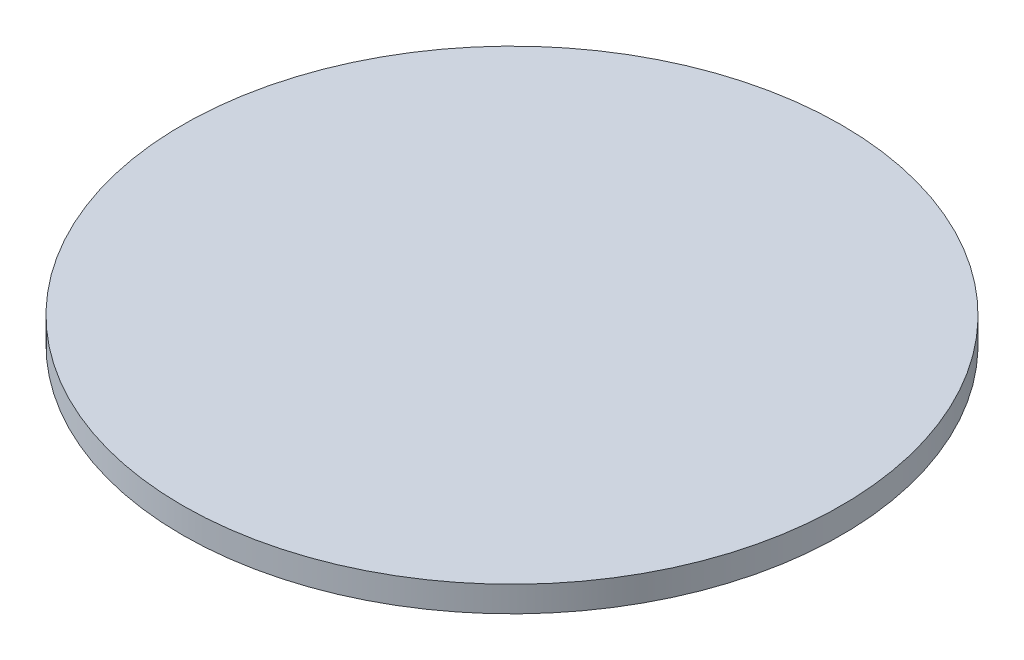
ISO-10303-21;
HEADER;
FILE_DESCRIPTION(('STEP AP214'),'2;1');
FILE_NAME('part.step','',(''),(''),'','','');
FILE_SCHEMA(('AUTOMOTIVE_DESIGN { 1 0 10303 214 1 1 1 1 }'));
ENDSEC;
DATA;
#1=APPLICATION_CONTEXT('core data for automotive mechanical design processes');
#2=APPLICATION_PROTOCOL_DEFINITION('international standard','automotive_design',2000,#1);
#3=PRODUCT_CONTEXT('',#1,'mechanical');
#4=PRODUCT('Part','Part','',(#3));
#5=PRODUCT_RELATED_PRODUCT_CATEGORY('part','',(#4));
#6=PRODUCT_DEFINITION_FORMATION('','',#4);
#7=PRODUCT_DEFINITION_CONTEXT('part definition',#1,'design');
#8=PRODUCT_DEFINITION('design','',#6,#7);
#9=PRODUCT_DEFINITION_SHAPE('','',#8);
#10=(LENGTH_UNIT() NAMED_UNIT(*) SI_UNIT(.MILLI.,.METRE.));
#11=(NAMED_UNIT(*) PLANE_ANGLE_UNIT() SI_UNIT($,.RADIAN.));
#12=(NAMED_UNIT(*) SI_UNIT($,.STERADIAN.) SOLID_ANGLE_UNIT());
#13=UNCERTAINTY_MEASURE_WITH_UNIT(LENGTH_MEASURE(1.E-05),#10,'distance_accuracy_value','');
#14=(GEOMETRIC_REPRESENTATION_CONTEXT(3) GLOBAL_UNCERTAINTY_ASSIGNED_CONTEXT((#13)) GLOBAL_UNIT_ASSIGNED_CONTEXT((#10,
#11,#12)) REPRESENTATION_CONTEXT('',''));
#15=CARTESIAN_POINT('',(0.,0.,0.));
#16=DIRECTION('',(0.,0.,1.));
#17=DIRECTION('',(1.,0.,0.));
#18=AXIS2_PLACEMENT_3D('',#15,#16,#17);
#19=CARTESIAN_POINT('',(0.,3.5,0.));
#20=DIRECTION('',(0.,-1.,0.));
#21=DIRECTION('',(0.,0.,-1.));
#22=AXIS2_PLACEMENT_3D('',#19,#20,#21);
#23=CYLINDRICAL_SURFACE('',#22,45.);
#24=CARTESIAN_POINT('',(0.,3.5,0.));
#25=DIRECTION('',(0.,1.,0.));
#26=DIRECTION('',(0.,0.,1.));
#27=AXIS2_PLACEMENT_3D('',#24,#25,#26);
#28=CIRCLE('',#27,45.);
#29=CARTESIAN_POINT('',(0.,3.5,45.));
#30=VERTEX_POINT('',#29);
#31=EDGE_CURVE('E193',#30,#30,#28,.T.);
#32=ORIENTED_EDGE('',*,*,#31,.F.);
#33=EDGE_LOOP('',(#32));
#34=FACE_BOUND('',#33,.T.);
#35=CARTESIAN_POINT('',(0.,0.,0.));
#36=DIRECTION('',(0.,1.,0.));
#37=DIRECTION('',(0.,0.,1.));
#38=AXIS2_PLACEMENT_3D('',#35,#36,#37);
#39=CIRCLE('',#38,45.);
#40=CARTESIAN_POINT('',(0.,0.,45.));
#41=VERTEX_POINT('',#40);
#42=EDGE_CURVE('E190',#41,#41,#39,.T.);
#43=ORIENTED_EDGE('',*,*,#42,.T.);
#44=EDGE_LOOP('',(#43));
#45=FACE_BOUND('',#44,.T.);
#46=ADVANCED_FACE('F35',(#34,#45),#23,.T.);
#47=CARTESIAN_POINT('',(0.,3.5,0.));
#48=DIRECTION('',(0.,1.,0.));
#49=DIRECTION('',(0.,0.,1.));
#50=AXIS2_PLACEMENT_3D('',#47,#48,#49);
#51=PLANE('',#50);
#52=ORIENTED_EDGE('',*,*,#31,.T.);
#53=EDGE_LOOP('',(#52));
#54=FACE_BOUND('',#53,.T.);
#55=ADVANCED_FACE('F248',(#54),#51,.T.);
#56=CARTESIAN_POINT('',(0.,0.,0.));
#57=DIRECTION('',(0.,1.,0.));
#58=DIRECTION('',(0.,0.,1.));
#59=AXIS2_PLACEMENT_3D('',#56,#57,#58);
#60=PLANE('',#59);
#61=CARTESIAN_POINT('',(0.985412509786568,0.,4.6178808699374));
#62=DIRECTION('',(0.,1.,0.));
#63=DIRECTION('',(0.,0.,1.));
#64=AXIS2_PLACEMENT_3D('',#61,#62,#63);
#65=CIRCLE('',#64,1.);
#66=CARTESIAN_POINT('',(1.35614381411026,0.,5.54662103811926));
#67=VERTEX_POINT('',#66);
#68=CARTESIAN_POINT('',(1.89701330918296,0.,4.20680425598344));
#69=VERTEX_POINT('',#68);
#70=EDGE_CURVE('E42',#67,#69,#65,.T.);
#71=ORIENTED_EDGE('',*,*,#70,.T.);
#72=CARTESIAN_POINT('',(0.985412509786567,0.,4.6178808699374));
#73=DIRECTION('',(0.,1.,0.));
#74=DIRECTION('',(0.,0.,1.));
#75=AXIS2_PLACEMENT_3D('',#72,#73,#74);
#76=CIRCLE('',#75,1.);
#77=CARTESIAN_POINT('',(0.614681205462874,0.,3.68914070175555));
#78=VERTEX_POINT('',#77);
#79=EDGE_CURVE('E11',#69,#78,#76,.T.);
#80=ORIENTED_EDGE('',*,*,#79,.T.);
#81=CARTESIAN_POINT('',(-7.47405796937291,0.,-16.5744218676921));
#82=DIRECTION('',(0.,1.,0.));
#83=DIRECTION('',(0.,0.,1.));
#84=AXIS2_PLACEMENT_3D('',#81,#82,#83);
#85=CIRCLE('',#84,21.8183333333333);
#86=CARTESIAN_POINT('',(-17.3060980082651,0.,-36.0518615895361));
#87=VERTEX_POINT('',#86);
#88=EDGE_CURVE('E220',#87,#78,#85,.T.);
#89=ORIENTED_EDGE('',*,*,#88,.F.);
#90=CARTESIAN_POINT('',(-17.7567300473252,0.,-36.9445713774138));
#91=DIRECTION('',(0.,1.,0.));
#92=DIRECTION('',(0.,0.,1.));
#93=AXIS2_PLACEMENT_3D('',#90,#91,#92);
#94=CIRCLE('',#93,1.);
#95=CARTESIAN_POINT('',(-16.8451292479288,0.,-37.3556479913677));
#96=VERTEX_POINT('',#95);
#97=EDGE_CURVE('E214',#87,#96,#94,.T.);
#98=ORIENTED_EDGE('',*,*,#97,.T.);
#99=CARTESIAN_POINT('',(-17.7567300473252,0.,-36.9445713774138));
#100=DIRECTION('',(0.,1.,0.));
#101=DIRECTION('',(0.,0.,1.));
#102=AXIS2_PLACEMENT_3D('',#99,#100,#101);
#103=CIRCLE('',#102,1.);
#104=CARTESIAN_POINT('',(-18.2073620863852,0.,-37.8372811652914));
#105=VERTEX_POINT('',#104);
#106=EDGE_CURVE('E217',#96,#105,#103,.T.);
#107=ORIENTED_EDGE('',*,*,#106,.T.);
#108=CARTESIAN_POINT('',(-7.47405796937291,0.,-16.5744218676921));
#109=DIRECTION('',(0.,1.,0.));
#110=DIRECTION('',(0.,0.,1.));
#111=AXIS2_PLACEMENT_3D('',#108,#109,#110);
#112=CIRCLE('',#111,23.8183333333333);
#113=EDGE_CURVE('E147',#67,#105,#112,.F.);
#114=ORIENTED_EDGE('',*,*,#113,.F.);
#115=EDGE_LOOP('',(#71,#80,#89,#98,#107,#114));
#116=FACE_BOUND('',#115,.T.);
#117=CARTESIAN_POINT('',(-0.985412509786523,0.,-4.61788086993744));
#118=DIRECTION('',(0.,1.,0.));
#119=DIRECTION('',(0.,0.,1.));
#120=AXIS2_PLACEMENT_3D('',#117,#118,#119);
#121=CIRCLE('',#120,1.);
#122=CARTESIAN_POINT('',(-1.35614381411021,0.,-5.5466210381193));
#123=VERTEX_POINT('',#122);
#124=CARTESIAN_POINT('',(-1.89701330918292,0.,-4.20680425598348));
#125=VERTEX_POINT('',#124);
#126=EDGE_CURVE('E208',#123,#125,#121,.T.);
#127=ORIENTED_EDGE('',*,*,#126,.T.);
#128=CARTESIAN_POINT('',(-0.985412509786521,0.,-4.61788086993744));
#129=DIRECTION('',(0.,1.,0.));
#130=DIRECTION('',(0.,0.,1.));
#131=AXIS2_PLACEMENT_3D('',#128,#129,#130);
#132=CIRCLE('',#131,1.);
#133=CARTESIAN_POINT('',(-0.614681205462835,0.,-3.68914070175558));
#134=VERTEX_POINT('',#133);
#135=EDGE_CURVE('E211',#125,#134,#132,.T.);
#136=ORIENTED_EDGE('',*,*,#135,.T.);
#137=CARTESIAN_POINT('',(7.47405796937281,0.,16.5744218676922));
#138=DIRECTION('',(0.,1.,0.));
#139=DIRECTION('',(0.,0.,1.));
#140=AXIS2_PLACEMENT_3D('',#137,#138,#139);
#141=CIRCLE('',#140,21.8183333333333);
#142=CARTESIAN_POINT('',(17.3060980082649,0.,36.0518615895362));
#143=VERTEX_POINT('',#142);
#144=EDGE_CURVE('E206',#143,#134,#141,.T.);
#145=ORIENTED_EDGE('',*,*,#144,.F.);
#146=CARTESIAN_POINT('',(17.7567300473249,0.,36.9445713774139));
#147=DIRECTION('',(0.,1.,0.));
#148=DIRECTION('',(0.,0.,1.));
#149=AXIS2_PLACEMENT_3D('',#146,#147,#148);
#150=CIRCLE('',#149,1.);
#151=CARTESIAN_POINT('',(16.8451292479285,0.,37.3556479913678));
#152=VERTEX_POINT('',#151);
#153=EDGE_CURVE('E196',#143,#152,#150,.T.);
#154=ORIENTED_EDGE('',*,*,#153,.T.);
#155=CARTESIAN_POINT('',(17.7567300473249,0.,36.9445713774139));
#156=DIRECTION('',(0.,1.,0.));
#157=DIRECTION('',(0.,0.,1.));
#158=AXIS2_PLACEMENT_3D('',#155,#156,#157);
#159=CIRCLE('',#158,1.);
#160=CARTESIAN_POINT('',(18.207362086385,0.,37.8372811652915));
#161=VERTEX_POINT('',#160);
#162=EDGE_CURVE('E201',#152,#161,#159,.T.);
#163=ORIENTED_EDGE('',*,*,#162,.T.);
#164=CARTESIAN_POINT('',(7.47405796937281,0.,16.5744218676922));
#165=DIRECTION('',(0.,1.,0.));
#166=DIRECTION('',(0.,0.,1.));
#167=AXIS2_PLACEMENT_3D('',#164,#165,#166);
#168=CIRCLE('',#167,23.8183333333333);
#169=EDGE_CURVE('E204',#123,#161,#168,.F.);
#170=ORIENTED_EDGE('',*,*,#169,.F.);
#171=EDGE_LOOP('',(#127,#136,#145,#154,#163,#170));
#172=FACE_BOUND('',#171,.T.);
#173=ORIENTED_EDGE('',*,*,#42,.F.);
#174=EDGE_LOOP('',(#173));
#175=FACE_BOUND('',#174,.T.);
#176=ADVANCED_FACE('F223',(#116,#172,#175),#60,.F.);
#177=CARTESIAN_POINT('',(7.47405796937281,2.49999999999997,16.5744218676922));
#178=DIRECTION('',(0.,-1.,0.));
#179=DIRECTION('',(-0.911600799396398,0.,0.411076613953954));
#180=AXIS2_PLACEMENT_3D('',#177,#178,#179);
#181=CYLINDRICAL_SURFACE('',#180,21.8183333333333);
#182=ORIENTED_EDGE('',*,*,#144,.T.);
#183=DIRECTION('',(0.,-1.,0.));
#184=VECTOR('',#183,1.);
#185=CARTESIAN_POINT('',(-0.614681205462835,2.49999999999997,-3.68914070175558));
#186=LINE('',#185,#184);
#187=CARTESIAN_POINT('',(-0.614681205462835,2.49999999999997,-3.68914070175558));
#188=VERTEX_POINT('',#187);
#189=EDGE_CURVE('E187',#188,#134,#186,.T.);
#190=ORIENTED_EDGE('',*,*,#189,.F.);
#191=CARTESIAN_POINT('',(7.47405796937281,2.49999999999997,16.5744218676922));
#192=DIRECTION('',(0.,-1.,0.));
#193=DIRECTION('',(0.911600799396398,0.,-0.411076613953954));
#194=AXIS2_PLACEMENT_3D('',#191,#192,#193);
#195=CIRCLE('',#194,21.8183333333333);
#196=CARTESIAN_POINT('',(17.3060980082649,2.49999999999997,36.0518615895362));
#197=VERTEX_POINT('',#196);
#198=EDGE_CURVE('E164',#188,#197,#195,.T.);
#199=ORIENTED_EDGE('',*,*,#198,.T.);
#200=DIRECTION('',(0.,-1.,0.));
#201=VECTOR('',#200,1.);
#202=CARTESIAN_POINT('',(17.3060980082649,2.49999999999997,36.0518615895362));
#203=LINE('',#202,#201);
#204=EDGE_CURVE('E185',#143,#197,#203,.F.);
#205=ORIENTED_EDGE('',*,*,#204,.F.);
#206=EDGE_LOOP('',(#182,#190,#199,#205));
#207=FACE_BOUND('',#206,.T.);
#208=ADVANCED_FACE('F260',(#207),#181,.T.);
#209=CARTESIAN_POINT('',(7.47405796937281,2.49999999999997,16.5744218676922));
#210=DIRECTION('',(0.,-1.,0.));
#211=DIRECTION('',(-0.911600799396398,0.,0.411076613953954));
#212=AXIS2_PLACEMENT_3D('',#209,#210,#211);
#213=CYLINDRICAL_SURFACE('',#212,23.8183333333333);
#214=ORIENTED_EDGE('',*,*,#169,.T.);
#215=DIRECTION('',(0.,-1.,0.));
#216=VECTOR('',#215,1.);
#217=CARTESIAN_POINT('',(18.207362086385,2.49999999999997,37.8372811652915));
#218=LINE('',#217,#216);
#219=CARTESIAN_POINT('',(18.207362086385,2.49999999999997,37.8372811652915));
#220=VERTEX_POINT('',#219);
#221=EDGE_CURVE('E171',#220,#161,#218,.T.);
#222=ORIENTED_EDGE('',*,*,#221,.F.);
#223=CARTESIAN_POINT('',(7.47405796937281,2.49999999999997,16.5744218676922));
#224=DIRECTION('',(0.,1.,0.));
#225=DIRECTION('',(0.911600799396398,0.,-0.411076613953954));
#226=AXIS2_PLACEMENT_3D('',#223,#224,#225);
#227=CIRCLE('',#226,23.8183333333333);
#228=CARTESIAN_POINT('',(-1.35614381411021,2.49999999999997,-5.5466210381193));
#229=VERTEX_POINT('',#228);
#230=EDGE_CURVE('E167',#220,#229,#227,.T.);
#231=ORIENTED_EDGE('',*,*,#230,.T.);
#232=DIRECTION('',(0.,-1.,0.));
#233=VECTOR('',#232,1.);
#234=CARTESIAN_POINT('',(-1.35614381411021,2.49999999999997,-5.5466210381193));
#235=LINE('',#234,#233);
#236=EDGE_CURVE('E174',#123,#229,#235,.F.);
#237=ORIENTED_EDGE('',*,*,#236,.F.);
#238=EDGE_LOOP('',(#214,#222,#231,#237));
#239=FACE_BOUND('',#238,.T.);
#240=ADVANCED_FACE('F264',(#239),#213,.F.);
#241=CARTESIAN_POINT('',(-0.985412509786521,2.49999999999997,-4.61788086993744));
#242=DIRECTION('',(0.,-1.,0.));
#243=DIRECTION('',(-0.911600799396398,0.,0.411076613953954));
#244=AXIS2_PLACEMENT_3D('',#241,#242,#243);
#245=CYLINDRICAL_SURFACE('',#244,1.);
#246=DIRECTION('',(0.,-1.,0.));
#247=VECTOR('',#246,1.);
#248=CARTESIAN_POINT('',(-1.89701330918292,2.49999999999997,-4.20680425598348));
#249=LINE('',#248,#247);
#250=CARTESIAN_POINT('',(-1.89701330918292,2.49999999999997,-4.20680425598348));
#251=VERTEX_POINT('',#250);
#252=EDGE_CURVE('E168',#125,#251,#249,.F.);
#253=ORIENTED_EDGE('',*,*,#252,.T.);
#254=CARTESIAN_POINT('',(-0.985412509786521,2.49999999999997,-4.61788086993744));
#255=DIRECTION('',(0.,1.,0.));
#256=DIRECTION('',(0.911600799396398,0.,-0.411076613953954));
#257=AXIS2_PLACEMENT_3D('',#254,#255,#256);
#258=CIRCLE('',#257,1.);
#259=EDGE_CURVE('E180',#251,#188,#258,.T.);
#260=ORIENTED_EDGE('',*,*,#259,.T.);
#261=ORIENTED_EDGE('',*,*,#189,.T.);
#262=ORIENTED_EDGE('',*,*,#135,.F.);
#263=EDGE_LOOP('',(#253,#260,#261,#262));
#264=FACE_BOUND('',#263,.T.);
#265=ADVANCED_FACE('F277',(#264),#245,.F.);
#266=CARTESIAN_POINT('',(-0.985412509786523,2.49999999999997,-4.61788086993744));
#267=DIRECTION('',(0.,-1.,0.));
#268=DIRECTION('',(-0.911600799396398,0.,0.411076613953954));
#269=AXIS2_PLACEMENT_3D('',#266,#267,#268);
#270=CYLINDRICAL_SURFACE('',#269,1.);
#271=ORIENTED_EDGE('',*,*,#236,.T.);
#272=CARTESIAN_POINT('',(-0.985412509786523,2.49999999999997,-4.61788086993744));
#273=DIRECTION('',(0.,1.,0.));
#274=DIRECTION('',(0.911600799396398,0.,-0.411076613953954));
#275=AXIS2_PLACEMENT_3D('',#272,#273,#274);
#276=CIRCLE('',#275,1.);
#277=EDGE_CURVE('E182',#229,#251,#276,.T.);
#278=ORIENTED_EDGE('',*,*,#277,.T.);
#279=ORIENTED_EDGE('',*,*,#252,.F.);
#280=ORIENTED_EDGE('',*,*,#126,.F.);
#281=EDGE_LOOP('',(#271,#278,#279,#280));
#282=FACE_BOUND('',#281,.T.);
#283=ADVANCED_FACE('F272',(#282),#270,.F.);
#284=CARTESIAN_POINT('',(17.7567300473249,2.49999999999997,36.9445713774139));
#285=DIRECTION('',(0.,-1.,0.));
#286=DIRECTION('',(-0.911600799396398,0.,0.411076613953954));
#287=AXIS2_PLACEMENT_3D('',#284,#285,#286);
#288=CYLINDRICAL_SURFACE('',#287,1.);
#289=DIRECTION('',(0.,-1.,0.));
#290=VECTOR('',#289,1.);
#291=CARTESIAN_POINT('',(16.8451292479285,2.49999999999997,37.3556479913678));
#292=LINE('',#291,#290);
#293=CARTESIAN_POINT('',(16.8451292479285,2.49999999999997,37.3556479913678));
#294=VERTEX_POINT('',#293);
#295=EDGE_CURVE('E57',#152,#294,#292,.F.);
#296=ORIENTED_EDGE('',*,*,#295,.T.);
#297=CARTESIAN_POINT('',(17.7567300473249,2.49999999999997,36.9445713774139));
#298=DIRECTION('',(0.,1.,0.));
#299=DIRECTION('',(0.911600799396398,0.,-0.411076613953954));
#300=AXIS2_PLACEMENT_3D('',#297,#298,#299);
#301=CIRCLE('',#300,1.);
#302=EDGE_CURVE('E176',#294,#220,#301,.T.);
#303=ORIENTED_EDGE('',*,*,#302,.T.);
#304=ORIENTED_EDGE('',*,*,#221,.T.);
#305=ORIENTED_EDGE('',*,*,#162,.F.);
#306=EDGE_LOOP('',(#296,#303,#304,#305));
#307=FACE_BOUND('',#306,.T.);
#308=ADVANCED_FACE('F268',(#307),#288,.F.);
#309=CARTESIAN_POINT('',(17.7567300473249,2.49999999999997,36.9445713774139));
#310=DIRECTION('',(0.,-1.,0.));
#311=DIRECTION('',(-0.911600799396398,0.,0.411076613953954));
#312=AXIS2_PLACEMENT_3D('',#309,#310,#311);
#313=CYLINDRICAL_SURFACE('',#312,1.);
#314=ORIENTED_EDGE('',*,*,#204,.T.);
#315=CARTESIAN_POINT('',(17.7567300473249,2.49999999999997,36.9445713774139));
#316=DIRECTION('',(0.,1.,0.));
#317=DIRECTION('',(0.911600799396398,0.,-0.411076613953954));
#318=AXIS2_PLACEMENT_3D('',#315,#316,#317);
#319=CIRCLE('',#318,1.);
#320=EDGE_CURVE('E178',#197,#294,#319,.T.);
#321=ORIENTED_EDGE('',*,*,#320,.T.);
#322=ORIENTED_EDGE('',*,*,#295,.F.);
#323=ORIENTED_EDGE('',*,*,#153,.F.);
#324=EDGE_LOOP('',(#314,#321,#322,#323));
#325=FACE_BOUND('',#324,.T.);
#326=ADVANCED_FACE('F271',(#325),#313,.F.);
#327=CARTESIAN_POINT('',(7.47405796937281,2.49999999999997,16.5744218676922));
#328=DIRECTION('',(0.,1.,0.));
#329=DIRECTION('',(0.911600799396398,0.,-0.411076613953954));
#330=AXIS2_PLACEMENT_3D('',#327,#328,#329);
#331=PLANE('',#330);
#332=ORIENTED_EDGE('',*,*,#230,.F.);
#333=ORIENTED_EDGE('',*,*,#302,.F.);
#334=ORIENTED_EDGE('',*,*,#320,.F.);
#335=ORIENTED_EDGE('',*,*,#198,.F.);
#336=ORIENTED_EDGE('',*,*,#259,.F.);
#337=ORIENTED_EDGE('',*,*,#277,.F.);
#338=EDGE_LOOP('',(#332,#333,#334,#335,#336,#337));
#339=FACE_BOUND('',#338,.T.);
#340=ADVANCED_FACE('F276',(#339),#331,.F.);
#341=CARTESIAN_POINT('',(-7.47405796937291,2.49999999999997,-16.5744218676921));
#342=DIRECTION('',(0.,-1.,0.));
#343=DIRECTION('',(0.911600799396395,0.,-0.41107661395396));
#344=AXIS2_PLACEMENT_3D('',#341,#342,#343);
#345=CYLINDRICAL_SURFACE('',#344,21.8183333333333);
#346=ORIENTED_EDGE('',*,*,#88,.T.);
#347=DIRECTION('',(0.,-1.,0.));
#348=VECTOR('',#347,1.);
#349=CARTESIAN_POINT('',(0.614681205462874,2.49999999999997,3.68914070175555));
#350=LINE('',#349,#348);
#351=CARTESIAN_POINT('',(0.614681205462874,2.49999999999997,3.68914070175555));
#352=VERTEX_POINT('',#351);
#353=EDGE_CURVE('E158',#352,#78,#350,.T.);
#354=ORIENTED_EDGE('',*,*,#353,.F.);
#355=CARTESIAN_POINT('',(-7.47405796937291,2.49999999999997,-16.5744218676921));
#356=DIRECTION('',(0.,-1.,0.));
#357=DIRECTION('',(-0.911600799396395,0.,0.41107661395396));
#358=AXIS2_PLACEMENT_3D('',#355,#356,#357);
#359=CIRCLE('',#358,21.8183333333333);
#360=CARTESIAN_POINT('',(-17.3060980082651,2.49999999999997,-36.0518615895361));
#361=VERTEX_POINT('',#360);
#362=EDGE_CURVE('E143',#352,#361,#359,.T.);
#363=ORIENTED_EDGE('',*,*,#362,.T.);
#364=DIRECTION('',(0.,-1.,0.));
#365=VECTOR('',#364,1.);
#366=CARTESIAN_POINT('',(-17.3060980082651,2.49999999999997,-36.0518615895361));
#367=LINE('',#366,#365);
#368=EDGE_CURVE('E156',#87,#361,#367,.F.);
#369=ORIENTED_EDGE('',*,*,#368,.F.);
#370=EDGE_LOOP('',(#346,#354,#363,#369));
#371=FACE_BOUND('',#370,.T.);
#372=ADVANCED_FACE('F235',(#371),#345,.T.);
#373=CARTESIAN_POINT('',(-7.47405796937291,2.49999999999997,-16.5744218676921));
#374=DIRECTION('',(0.,-1.,0.));
#375=DIRECTION('',(0.911600799396395,0.,-0.41107661395396));
#376=AXIS2_PLACEMENT_3D('',#373,#374,#375);
#377=CYLINDRICAL_SURFACE('',#376,23.8183333333333);
#378=ORIENTED_EDGE('',*,*,#113,.T.);
#379=DIRECTION('',(0.,-1.,0.));
#380=VECTOR('',#379,1.);
#381=CARTESIAN_POINT('',(-18.2073620863852,2.49999999999997,-37.8372811652914));
#382=LINE('',#381,#380);
#383=CARTESIAN_POINT('',(-18.2073620863852,2.49999999999997,-37.8372811652914));
#384=VERTEX_POINT('',#383);
#385=EDGE_CURVE('E127',#384,#105,#382,.T.);
#386=ORIENTED_EDGE('',*,*,#385,.F.);
#387=CARTESIAN_POINT('',(-7.47405796937291,2.49999999999997,-16.5744218676921));
#388=DIRECTION('',(0.,1.,0.));
#389=DIRECTION('',(-0.911600799396395,0.,0.41107661395396));
#390=AXIS2_PLACEMENT_3D('',#387,#388,#389);
#391=CIRCLE('',#390,23.8183333333333);
#392=CARTESIAN_POINT('',(1.35614381411026,2.49999999999997,5.54662103811926));
#393=VERTEX_POINT('',#392);
#394=EDGE_CURVE('E136',#384,#393,#391,.T.);
#395=ORIENTED_EDGE('',*,*,#394,.T.);
#396=DIRECTION('',(0.,-1.,0.));
#397=VECTOR('',#396,1.);
#398=CARTESIAN_POINT('',(1.35614381411026,2.49999999999997,5.54662103811926));
#399=LINE('',#398,#397);
#400=EDGE_CURVE('E132',#67,#393,#399,.F.);
#401=ORIENTED_EDGE('',*,*,#400,.F.);
#402=EDGE_LOOP('',(#378,#386,#395,#401));
#403=FACE_BOUND('',#402,.T.);
#404=ADVANCED_FACE('F145',(#403),#377,.F.);
#405=CARTESIAN_POINT('',(0.985412509786567,2.49999999999997,4.6178808699374));
#406=DIRECTION('',(0.,-1.,0.));
#407=DIRECTION('',(0.911600799396395,0.,-0.41107661395396));
#408=AXIS2_PLACEMENT_3D('',#405,#406,#407);
#409=CYLINDRICAL_SURFACE('',#408,1.);
#410=DIRECTION('',(0.,-1.,0.));
#411=VECTOR('',#410,1.);
#412=CARTESIAN_POINT('',(1.89701330918296,2.49999999999997,4.20680425598344));
#413=LINE('',#412,#411);
#414=CARTESIAN_POINT('',(1.89701330918296,2.49999999999997,4.20680425598344));
#415=VERTEX_POINT('',#414);
#416=EDGE_CURVE('E161',#69,#415,#413,.F.);
#417=ORIENTED_EDGE('',*,*,#416,.T.);
#418=CARTESIAN_POINT('',(0.985412509786567,2.49999999999997,4.6178808699374));
#419=DIRECTION('',(0.,1.,0.));
#420=DIRECTION('',(-0.911600799396395,0.,0.41107661395396));
#421=AXIS2_PLACEMENT_3D('',#418,#419,#420);
#422=CIRCLE('',#421,1.);
#423=EDGE_CURVE('E153',#415,#352,#422,.T.);
#424=ORIENTED_EDGE('',*,*,#423,.T.);
#425=ORIENTED_EDGE('',*,*,#353,.T.);
#426=ORIENTED_EDGE('',*,*,#79,.F.);
#427=EDGE_LOOP('',(#417,#424,#425,#426));
#428=FACE_BOUND('',#427,.T.);
#429=ADVANCED_FACE('F230',(#428),#409,.F.);
#430=CARTESIAN_POINT('',(0.985412509786568,2.49999999999997,4.6178808699374));
#431=DIRECTION('',(0.,-1.,0.));
#432=DIRECTION('',(0.911600799396395,0.,-0.41107661395396));
#433=AXIS2_PLACEMENT_3D('',#430,#431,#432);
#434=CYLINDRICAL_SURFACE('',#433,1.);
#435=ORIENTED_EDGE('',*,*,#400,.T.);
#436=CARTESIAN_POINT('',(0.985412509786568,2.49999999999997,4.6178808699374));
#437=DIRECTION('',(0.,1.,0.));
#438=DIRECTION('',(-0.911600799396395,0.,0.41107661395396));
#439=AXIS2_PLACEMENT_3D('',#436,#437,#438);
#440=CIRCLE('',#439,1.);
#441=EDGE_CURVE('E140',#393,#415,#440,.T.);
#442=ORIENTED_EDGE('',*,*,#441,.T.);
#443=ORIENTED_EDGE('',*,*,#416,.F.);
#444=ORIENTED_EDGE('',*,*,#70,.F.);
#445=EDGE_LOOP('',(#435,#442,#443,#444));
#446=FACE_BOUND('',#445,.T.);
#447=ADVANCED_FACE('F228',(#446),#434,.F.);
#448=CARTESIAN_POINT('',(-17.7567300473252,2.49999999999997,-36.9445713774138));
#449=DIRECTION('',(0.,-1.,0.));
#450=DIRECTION('',(0.911600799396395,0.,-0.41107661395396));
#451=AXIS2_PLACEMENT_3D('',#448,#449,#450);
#452=CYLINDRICAL_SURFACE('',#451,1.);
#453=DIRECTION('',(0.,-1.,0.));
#454=VECTOR('',#453,1.);
#455=CARTESIAN_POINT('',(-16.8451292479288,2.49999999999997,-37.3556479913677));
#456=LINE('',#455,#454);
#457=CARTESIAN_POINT('',(-16.8451292479288,2.49999999999997,-37.3556479913677));
#458=VERTEX_POINT('',#457);
#459=EDGE_CURVE('E49',#96,#458,#456,.F.);
#460=ORIENTED_EDGE('',*,*,#459,.T.);
#461=CARTESIAN_POINT('',(-17.7567300473252,2.49999999999997,-36.9445713774138));
#462=DIRECTION('',(0.,1.,0.));
#463=DIRECTION('',(-0.911600799396395,0.,0.41107661395396));
#464=AXIS2_PLACEMENT_3D('',#461,#462,#463);
#465=CIRCLE('',#464,1.);
#466=EDGE_CURVE('E123',#458,#384,#465,.T.);
#467=ORIENTED_EDGE('',*,*,#466,.T.);
#468=ORIENTED_EDGE('',*,*,#385,.T.);
#469=ORIENTED_EDGE('',*,*,#106,.F.);
#470=EDGE_LOOP('',(#460,#467,#468,#469));
#471=FACE_BOUND('',#470,.T.);
#472=ADVANCED_FACE('F125',(#471),#452,.F.);
#473=CARTESIAN_POINT('',(-17.7567300473252,2.49999999999997,-36.9445713774138));
#474=DIRECTION('',(0.,-1.,0.));
#475=DIRECTION('',(0.911600799396395,0.,-0.41107661395396));
#476=AXIS2_PLACEMENT_3D('',#473,#474,#475);
#477=CYLINDRICAL_SURFACE('',#476,1.);
#478=ORIENTED_EDGE('',*,*,#368,.T.);
#479=CARTESIAN_POINT('',(-17.7567300473252,2.49999999999997,-36.9445713774138));
#480=DIRECTION('',(0.,1.,0.));
#481=DIRECTION('',(-0.911600799396395,0.,0.41107661395396));
#482=AXIS2_PLACEMENT_3D('',#479,#480,#481);
#483=CIRCLE('',#482,1.);
#484=EDGE_CURVE('E131',#361,#458,#483,.T.);
#485=ORIENTED_EDGE('',*,*,#484,.T.);
#486=ORIENTED_EDGE('',*,*,#459,.F.);
#487=ORIENTED_EDGE('',*,*,#97,.F.);
#488=EDGE_LOOP('',(#478,#485,#486,#487));
#489=FACE_BOUND('',#488,.T.);
#490=ADVANCED_FACE('F237',(#489),#477,.F.);
#491=CARTESIAN_POINT('',(-7.47405796937291,2.49999999999997,-16.5744218676921));
#492=DIRECTION('',(0.,1.,0.));
#493=DIRECTION('',(-0.911600799396395,0.,0.41107661395396));
#494=AXIS2_PLACEMENT_3D('',#491,#492,#493);
#495=PLANE('',#494);
#496=ORIENTED_EDGE('',*,*,#394,.F.);
#497=ORIENTED_EDGE('',*,*,#466,.F.);
#498=ORIENTED_EDGE('',*,*,#484,.F.);
#499=ORIENTED_EDGE('',*,*,#362,.F.);
#500=ORIENTED_EDGE('',*,*,#423,.F.);
#501=ORIENTED_EDGE('',*,*,#441,.F.);
#502=EDGE_LOOP('',(#496,#497,#498,#499,#500,#501));
#503=FACE_BOUND('',#502,.T.);
#504=ADVANCED_FACE('F137',(#503),#495,.F.);
#505=CLOSED_SHELL('',(#46,#55,#176,#208,#240,#265,#283,#308,#326,#340,#372,#404,#429,#447,#472,
#490,#504));
#506=MANIFOLD_SOLID_BREP('B2',#505);
#507=ADVANCED_BREP_SHAPE_REPRESENTATION('',(#18,#506),#14);
#508=SHAPE_DEFINITION_REPRESENTATION(#9,#507);
ENDSEC;
END-ISO-10303-21;
